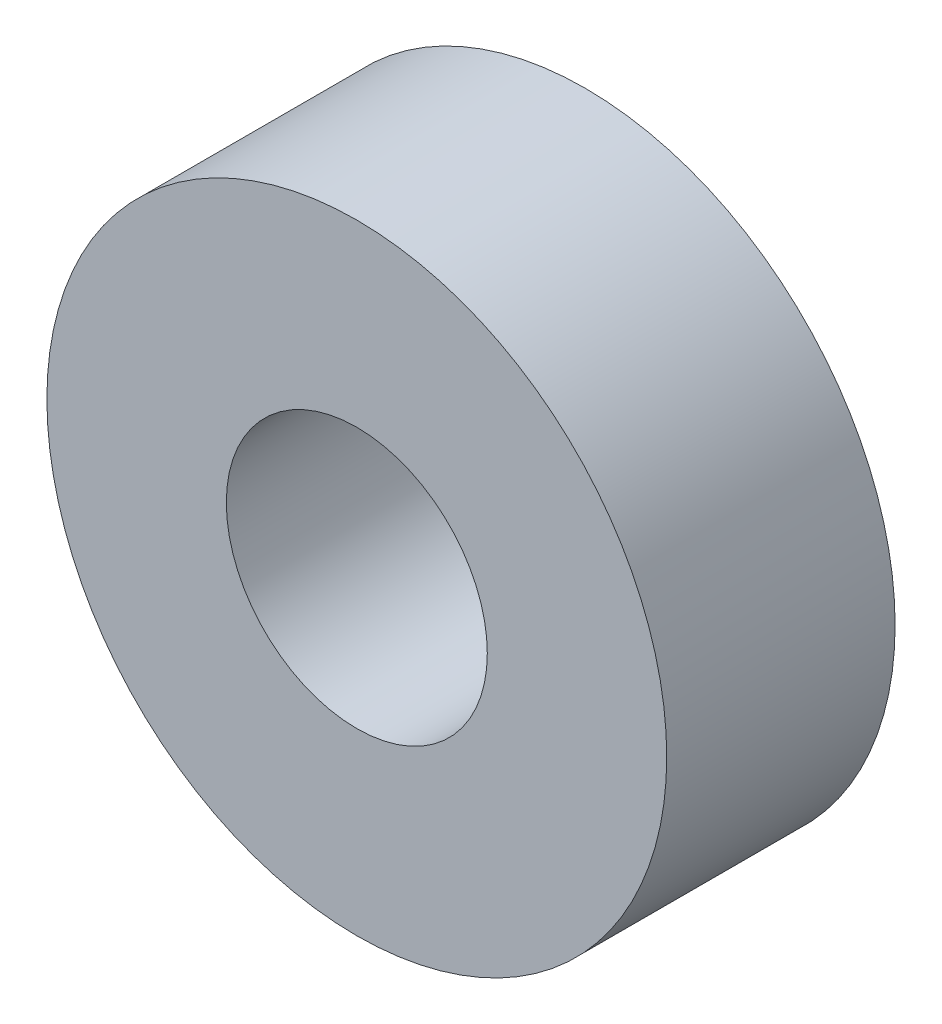
ISO-10303-21;
HEADER;
FILE_DESCRIPTION(('STEP AP214'),'2;1');
FILE_NAME('part.step','',(''),(''),'','','');
FILE_SCHEMA(('AUTOMOTIVE_DESIGN { 1 0 10303 214 1 1 1 1 }'));
ENDSEC;
DATA;
#1=APPLICATION_CONTEXT('core data for automotive mechanical design processes');
#2=APPLICATION_PROTOCOL_DEFINITION('international standard','automotive_design',2000,#1);
#3=PRODUCT_CONTEXT('',#1,'mechanical');
#4=PRODUCT('Part','Part','',(#3));
#5=PRODUCT_RELATED_PRODUCT_CATEGORY('part','',(#4));
#6=PRODUCT_DEFINITION_FORMATION('','',#4);
#7=PRODUCT_DEFINITION_CONTEXT('part definition',#1,'design');
#8=PRODUCT_DEFINITION('design','',#6,#7);
#9=PRODUCT_DEFINITION_SHAPE('','',#8);
#10=(LENGTH_UNIT() NAMED_UNIT(*) SI_UNIT(.MILLI.,.METRE.));
#11=(NAMED_UNIT(*) PLANE_ANGLE_UNIT() SI_UNIT($,.RADIAN.));
#12=(NAMED_UNIT(*) SI_UNIT($,.STERADIAN.) SOLID_ANGLE_UNIT());
#13=UNCERTAINTY_MEASURE_WITH_UNIT(LENGTH_MEASURE(1.E-05),#10,'distance_accuracy_value','');
#14=(GEOMETRIC_REPRESENTATION_CONTEXT(3) GLOBAL_UNCERTAINTY_ASSIGNED_CONTEXT((#13)) GLOBAL_UNIT_ASSIGNED_CONTEXT((#10,
#11,#12)) REPRESENTATION_CONTEXT('',''));
#15=CARTESIAN_POINT('',(0.,0.,0.));
#16=DIRECTION('',(0.,0.,1.));
#17=DIRECTION('',(1.,0.,0.));
#18=AXIS2_PLACEMENT_3D('',#15,#16,#17);
#19=CARTESIAN_POINT('',(0.,0.,0.));
#20=DIRECTION('',(0.,0.,1.));
#21=DIRECTION('',(1.,0.,0.));
#22=AXIS2_PLACEMENT_3D('',#19,#20,#21);
#23=CYLINDRICAL_SURFACE('',#22,4.);
#24=CARTESIAN_POINT('',(0.,0.,0.));
#25=DIRECTION('',(0.,0.,1.));
#26=DIRECTION('',(1.,0.,0.));
#27=AXIS2_PLACEMENT_3D('',#24,#25,#26);
#28=CIRCLE('',#27,4.);
#29=CARTESIAN_POINT('',(4.,0.,0.));
#30=VERTEX_POINT('',#29);
#31=EDGE_CURVE('E27',#30,#30,#28,.T.);
#32=ORIENTED_EDGE('',*,*,#31,.F.);
#33=EDGE_LOOP('',(#32));
#34=FACE_BOUND('',#33,.T.);
#35=CARTESIAN_POINT('',(0.,0.,7.));
#36=DIRECTION('',(0.,0.,1.));
#37=DIRECTION('',(1.,0.,0.));
#38=AXIS2_PLACEMENT_3D('',#35,#36,#37);
#39=CIRCLE('',#38,4.);
#40=CARTESIAN_POINT('',(4.,0.,7.));
#41=VERTEX_POINT('',#40);
#42=EDGE_CURVE('E18',#41,#41,#39,.T.);
#43=ORIENTED_EDGE('',*,*,#42,.T.);
#44=EDGE_LOOP('',(#43));
#45=FACE_BOUND('',#44,.T.);
#46=ADVANCED_FACE('F15',(#34,#45),#23,.F.);
#47=CARTESIAN_POINT('',(0.,0.,7.));
#48=DIRECTION('',(0.,0.,-1.));
#49=DIRECTION('',(-1.,0.,0.));
#50=AXIS2_PLACEMENT_3D('',#47,#48,#49);
#51=PLANE('',#50);
#52=ORIENTED_EDGE('',*,*,#42,.F.);
#53=EDGE_LOOP('',(#52));
#54=FACE_BOUND('',#53,.T.);
#55=CARTESIAN_POINT('',(0.,0.,7.));
#56=DIRECTION('',(0.,0.,1.));
#57=DIRECTION('',(1.,0.,0.));
#58=AXIS2_PLACEMENT_3D('',#55,#56,#57);
#59=CIRCLE('',#58,9.5);
#60=CARTESIAN_POINT('',(9.5,0.,7.));
#61=VERTEX_POINT('',#60);
#62=EDGE_CURVE('E22',#61,#61,#59,.F.);
#63=ORIENTED_EDGE('',*,*,#62,.F.);
#64=EDGE_LOOP('',(#63));
#65=FACE_BOUND('',#64,.T.);
#66=ADVANCED_FACE('F36',(#54,#65),#51,.F.);
#67=CARTESIAN_POINT('',(0.,0.,0.));
#68=DIRECTION('',(0.,0.,-1.));
#69=DIRECTION('',(-1.,0.,0.));
#70=AXIS2_PLACEMENT_3D('',#67,#68,#69);
#71=PLANE('',#70);
#72=ORIENTED_EDGE('',*,*,#31,.T.);
#73=EDGE_LOOP('',(#72));
#74=FACE_BOUND('',#73,.T.);
#75=CARTESIAN_POINT('',(0.,0.,0.));
#76=DIRECTION('',(0.,0.,1.));
#77=DIRECTION('',(1.,0.,0.));
#78=AXIS2_PLACEMENT_3D('',#75,#76,#77);
#79=CIRCLE('',#78,9.5);
#80=CARTESIAN_POINT('',(9.5,0.,0.));
#81=VERTEX_POINT('',#80);
#82=EDGE_CURVE('E10',#81,#81,#79,.T.);
#83=ORIENTED_EDGE('',*,*,#82,.F.);
#84=EDGE_LOOP('',(#83));
#85=FACE_BOUND('',#84,.T.);
#86=ADVANCED_FACE('F39',(#74,#85),#71,.T.);
#87=CARTESIAN_POINT('',(0.,0.,0.));
#88=DIRECTION('',(0.,0.,1.));
#89=DIRECTION('',(1.,0.,0.));
#90=AXIS2_PLACEMENT_3D('',#87,#88,#89);
#91=CYLINDRICAL_SURFACE('',#90,9.5);
#92=ORIENTED_EDGE('',*,*,#82,.T.);
#93=EDGE_LOOP('',(#92));
#94=FACE_BOUND('',#93,.T.);
#95=ORIENTED_EDGE('',*,*,#62,.T.);
#96=EDGE_LOOP('',(#95));
#97=FACE_BOUND('',#96,.T.);
#98=ADVANCED_FACE('F42',(#94,#97),#91,.T.);
#99=CLOSED_SHELL('',(#46,#66,#86,#98));
#100=MANIFOLD_SOLID_BREP('B1',#99);
#101=ADVANCED_BREP_SHAPE_REPRESENTATION('',(#18,#100),#14);
#102=SHAPE_DEFINITION_REPRESENTATION(#9,#101);
ENDSEC;
END-ISO-10303-21;
